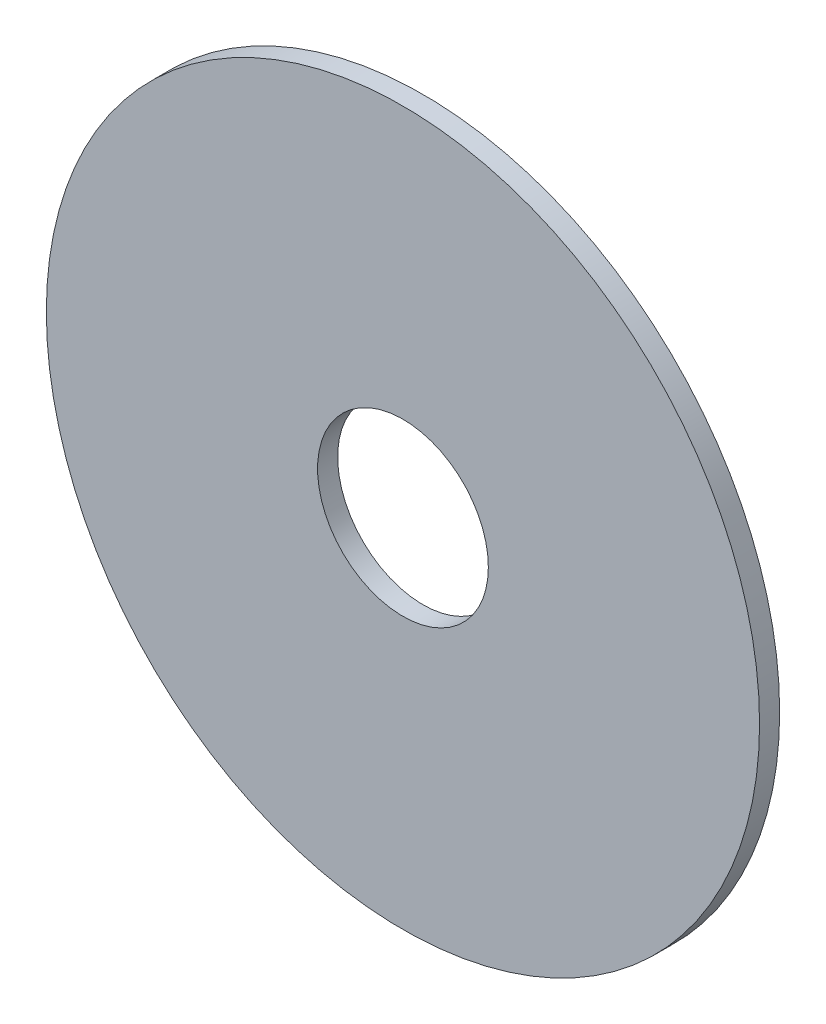
ISO-10303-21;
HEADER;
FILE_DESCRIPTION(('STEP AP214'),'2;1');
FILE_NAME('part.step','',(''),(''),'','','');
FILE_SCHEMA(('AUTOMOTIVE_DESIGN { 1 0 10303 214 1 1 1 1 }'));
ENDSEC;
DATA;
#1=APPLICATION_CONTEXT('core data for automotive mechanical design processes');
#2=APPLICATION_PROTOCOL_DEFINITION('international standard','automotive_design',2000,#1);
#3=PRODUCT_CONTEXT('',#1,'mechanical');
#4=PRODUCT('Part','Part','',(#3));
#5=PRODUCT_RELATED_PRODUCT_CATEGORY('part','',(#4));
#6=PRODUCT_DEFINITION_FORMATION('','',#4);
#7=PRODUCT_DEFINITION_CONTEXT('part definition',#1,'design');
#8=PRODUCT_DEFINITION('design','',#6,#7);
#9=PRODUCT_DEFINITION_SHAPE('','',#8);
#10=(LENGTH_UNIT() NAMED_UNIT(*) SI_UNIT(.MILLI.,.METRE.));
#11=(NAMED_UNIT(*) PLANE_ANGLE_UNIT() SI_UNIT($,.RADIAN.));
#12=(NAMED_UNIT(*) SI_UNIT($,.STERADIAN.) SOLID_ANGLE_UNIT());
#13=UNCERTAINTY_MEASURE_WITH_UNIT(LENGTH_MEASURE(1.E-05),#10,'distance_accuracy_value','');
#14=(GEOMETRIC_REPRESENTATION_CONTEXT(3) GLOBAL_UNCERTAINTY_ASSIGNED_CONTEXT((#13)) GLOBAL_UNIT_ASSIGNED_CONTEXT((#10,
#11,#12)) REPRESENTATION_CONTEXT('',''));
#15=CARTESIAN_POINT('',(0.,0.,0.));
#16=DIRECTION('',(0.,0.,1.));
#17=DIRECTION('',(1.,0.,0.));
#18=AXIS2_PLACEMENT_3D('',#15,#16,#17);
#19=CARTESIAN_POINT('',(0.,0.,10.));
#20=DIRECTION('',(0.,0.,1.));
#21=DIRECTION('',(1.,0.,0.));
#22=AXIS2_PLACEMENT_3D('',#19,#20,#21);
#23=PLANE('',#22);
#24=CARTESIAN_POINT('',(0.,0.,10.));
#25=DIRECTION('',(0.,0.,1.));
#26=DIRECTION('',(1.,0.,0.));
#27=AXIS2_PLACEMENT_3D('',#24,#25,#26);
#28=CIRCLE('',#27,177.5);
#29=CARTESIAN_POINT('',(177.5,0.,10.));
#30=VERTEX_POINT('',#29);
#31=EDGE_CURVE('E10',#30,#30,#28,.T.);
#32=ORIENTED_EDGE('',*,*,#31,.T.);
#33=EDGE_LOOP('',(#32));
#34=FACE_BOUND('',#33,.T.);
#35=CARTESIAN_POINT('',(0.,0.,10.));
#36=DIRECTION('',(0.,0.,1.));
#37=DIRECTION('',(1.,0.,0.));
#38=AXIS2_PLACEMENT_3D('',#35,#36,#37);
#39=CIRCLE('',#38,42.5);
#40=CARTESIAN_POINT('',(42.5,0.,10.));
#41=VERTEX_POINT('',#40);
#42=EDGE_CURVE('E46',#41,#41,#39,.T.);
#43=ORIENTED_EDGE('',*,*,#42,.F.);
#44=EDGE_LOOP('',(#43));
#45=FACE_BOUND('',#44,.T.);
#46=ADVANCED_FACE('F35',(#34,#45),#23,.T.);
#47=CARTESIAN_POINT('',(0.,0.,0.));
#48=DIRECTION('',(0.,0.,1.));
#49=DIRECTION('',(1.,0.,0.));
#50=AXIS2_PLACEMENT_3D('',#47,#48,#49);
#51=PLANE('',#50);
#52=CARTESIAN_POINT('',(0.,0.,0.));
#53=DIRECTION('',(0.,0.,1.));
#54=DIRECTION('',(1.,0.,0.));
#55=AXIS2_PLACEMENT_3D('',#52,#53,#54);
#56=CIRCLE('',#55,177.5);
#57=CARTESIAN_POINT('',(177.5,0.,0.));
#58=VERTEX_POINT('',#57);
#59=EDGE_CURVE('E39',#58,#58,#56,.T.);
#60=ORIENTED_EDGE('',*,*,#59,.F.);
#61=EDGE_LOOP('',(#60));
#62=FACE_BOUND('',#61,.T.);
#63=CARTESIAN_POINT('',(0.,0.,0.));
#64=DIRECTION('',(0.,0.,1.));
#65=DIRECTION('',(1.,0.,0.));
#66=AXIS2_PLACEMENT_3D('',#63,#64,#65);
#67=CIRCLE('',#66,42.5);
#68=CARTESIAN_POINT('',(42.5,0.,0.));
#69=VERTEX_POINT('',#68);
#70=EDGE_CURVE('E48',#69,#69,#67,.T.);
#71=ORIENTED_EDGE('',*,*,#70,.T.);
#72=EDGE_LOOP('',(#71));
#73=FACE_BOUND('',#72,.T.);
#74=ADVANCED_FACE('F58',(#62,#73),#51,.F.);
#75=CARTESIAN_POINT('',(0.,0.,10.));
#76=DIRECTION('',(0.,0.,-1.));
#77=DIRECTION('',(-1.,0.,0.));
#78=AXIS2_PLACEMENT_3D('',#75,#76,#77);
#79=CYLINDRICAL_SURFACE('',#78,177.5);
#80=ORIENTED_EDGE('',*,*,#31,.F.);
#81=EDGE_LOOP('',(#80));
#82=FACE_BOUND('',#81,.T.);
#83=ORIENTED_EDGE('',*,*,#59,.T.);
#84=EDGE_LOOP('',(#83));
#85=FACE_BOUND('',#84,.T.);
#86=ADVANCED_FACE('F37',(#82,#85),#79,.T.);
#87=CARTESIAN_POINT('',(0.,0.,10.));
#88=DIRECTION('',(0.,0.,-1.));
#89=DIRECTION('',(-1.,0.,0.));
#90=AXIS2_PLACEMENT_3D('',#87,#88,#89);
#91=CYLINDRICAL_SURFACE('',#90,42.5);
#92=ORIENTED_EDGE('',*,*,#42,.T.);
#93=EDGE_LOOP('',(#92));
#94=FACE_BOUND('',#93,.T.);
#95=ORIENTED_EDGE('',*,*,#70,.F.);
#96=EDGE_LOOP('',(#95));
#97=FACE_BOUND('',#96,.T.);
#98=ADVANCED_FACE('F54',(#94,#97),#91,.F.);
#99=CLOSED_SHELL('',(#46,#74,#86,#98));
#100=MANIFOLD_SOLID_BREP('B2',#99);
#101=ADVANCED_BREP_SHAPE_REPRESENTATION('',(#18,#100),#14);
#102=SHAPE_DEFINITION_REPRESENTATION(#9,#101);
ENDSEC;
END-ISO-10303-21;
